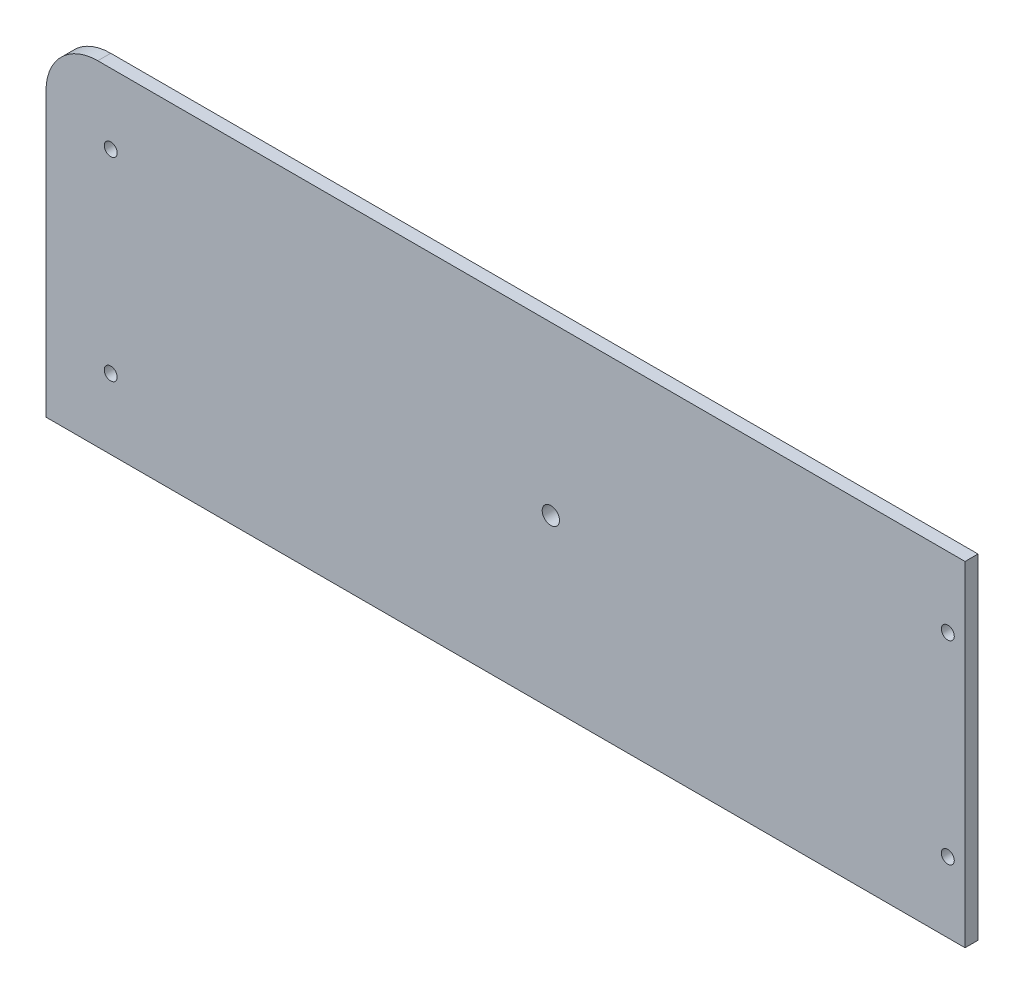
ISO-10303-21;
HEADER;
FILE_DESCRIPTION(('STEP AP214'),'2;1');
FILE_NAME('part.step','',(''),(''),'','','');
FILE_SCHEMA(('AUTOMOTIVE_DESIGN { 1 0 10303 214 1 1 1 1 }'));
ENDSEC;
DATA;
#1=APPLICATION_CONTEXT('core data for automotive mechanical design processes');
#2=APPLICATION_PROTOCOL_DEFINITION('international standard','automotive_design',2000,#1);
#3=PRODUCT_CONTEXT('',#1,'mechanical');
#4=PRODUCT('Part','Part','',(#3));
#5=PRODUCT_RELATED_PRODUCT_CATEGORY('part','',(#4));
#6=PRODUCT_DEFINITION_FORMATION('','',#4);
#7=PRODUCT_DEFINITION_CONTEXT('part definition',#1,'design');
#8=PRODUCT_DEFINITION('design','',#6,#7);
#9=PRODUCT_DEFINITION_SHAPE('','',#8);
#10=(LENGTH_UNIT() NAMED_UNIT(*) SI_UNIT(.MILLI.,.METRE.));
#11=(NAMED_UNIT(*) PLANE_ANGLE_UNIT() SI_UNIT($,.RADIAN.));
#12=(NAMED_UNIT(*) SI_UNIT($,.STERADIAN.) SOLID_ANGLE_UNIT());
#13=UNCERTAINTY_MEASURE_WITH_UNIT(LENGTH_MEASURE(1.E-05),#10,'distance_accuracy_value','');
#14=(GEOMETRIC_REPRESENTATION_CONTEXT(3) GLOBAL_UNCERTAINTY_ASSIGNED_CONTEXT((#13)) GLOBAL_UNIT_ASSIGNED_CONTEXT((#10,
#11,#12)) REPRESENTATION_CONTEXT('',''));
#15=CARTESIAN_POINT('',(0.,0.,0.));
#16=DIRECTION('',(0.,0.,1.));
#17=DIRECTION('',(1.,0.,0.));
#18=AXIS2_PLACEMENT_3D('',#15,#16,#17);
#19=CARTESIAN_POINT('',(106.5,-38.77,3.));
#20=DIRECTION('',(-1.,0.,0.));
#21=DIRECTION('',(0.,0.,1.));
#22=AXIS2_PLACEMENT_3D('',#19,#20,#21);
#23=PLANE('',#22);
#24=DIRECTION('',(0.,1.,0.));
#25=VECTOR('',#24,1.);
#26=CARTESIAN_POINT('',(106.5,-38.77,0.));
#27=LINE('',#26,#25);
#28=CARTESIAN_POINT('',(106.5,-38.77,0.));
#29=VERTEX_POINT('',#28);
#30=CARTESIAN_POINT('',(106.5,38.77,0.));
#31=VERTEX_POINT('',#30);
#32=EDGE_CURVE('E109',#29,#31,#27,.T.);
#33=ORIENTED_EDGE('',*,*,#32,.T.);
#34=DIRECTION('',(0.,0.,-1.));
#35=VECTOR('',#34,1.);
#36=CARTESIAN_POINT('',(106.5,38.77,3.));
#37=LINE('',#36,#35);
#38=CARTESIAN_POINT('',(106.5,38.77,3.));
#39=VERTEX_POINT('',#38);
#40=EDGE_CURVE('E90',#39,#31,#37,.T.);
#41=ORIENTED_EDGE('',*,*,#40,.F.);
#42=DIRECTION('',(0.,1.,0.));
#43=VECTOR('',#42,1.);
#44=CARTESIAN_POINT('',(106.5,-38.77,3.));
#45=LINE('',#44,#43);
#46=CARTESIAN_POINT('',(106.5,-38.77,3.));
#47=VERTEX_POINT('',#46);
#48=EDGE_CURVE('E96',#47,#39,#45,.T.);
#49=ORIENTED_EDGE('',*,*,#48,.F.);
#50=DIRECTION('',(0.,0.,-1.));
#51=VECTOR('',#50,1.);
#52=CARTESIAN_POINT('',(106.5,-38.77,3.));
#53=LINE('',#52,#51);
#54=EDGE_CURVE('E119',#47,#29,#53,.T.);
#55=ORIENTED_EDGE('',*,*,#54,.T.);
#56=EDGE_LOOP('',(#33,#41,#49,#55));
#57=FACE_BOUND('',#56,.T.);
#58=ADVANCED_FACE('F42',(#57),#23,.F.);
#59=CARTESIAN_POINT('',(-106.5,38.77,3.));
#60=DIRECTION('',(0.,-1.,0.));
#61=DIRECTION('',(0.,0.,-1.));
#62=AXIS2_PLACEMENT_3D('',#59,#60,#61);
#63=PLANE('',#62);
#64=DIRECTION('',(-1.,0.,0.));
#65=VECTOR('',#64,1.);
#66=CARTESIAN_POINT('',(-106.5,38.77,0.));
#67=LINE('',#66,#65);
#68=CARTESIAN_POINT('',(-94.5,38.77,0.));
#69=VERTEX_POINT('',#68);
#70=EDGE_CURVE('E132',#31,#69,#67,.T.);
#71=ORIENTED_EDGE('',*,*,#70,.T.);
#72=DIRECTION('',(0.,0.,-1.));
#73=VECTOR('',#72,1.);
#74=CARTESIAN_POINT('',(-94.5,38.77,3.));
#75=LINE('',#74,#73);
#76=CARTESIAN_POINT('',(-94.5,38.77,3.));
#77=VERTEX_POINT('',#76);
#78=EDGE_CURVE('E51',#69,#77,#75,.F.);
#79=ORIENTED_EDGE('',*,*,#78,.T.);
#80=DIRECTION('',(-1.,0.,0.));
#81=VECTOR('',#80,1.);
#82=CARTESIAN_POINT('',(-106.5,38.77,3.));
#83=LINE('',#82,#81);
#84=EDGE_CURVE('E86',#39,#77,#83,.T.);
#85=ORIENTED_EDGE('',*,*,#84,.F.);
#86=ORIENTED_EDGE('',*,*,#40,.T.);
#87=EDGE_LOOP('',(#71,#79,#85,#86));
#88=FACE_BOUND('',#87,.T.);
#89=ADVANCED_FACE('F88',(#88),#63,.F.);
#90=CARTESIAN_POINT('',(-106.5,-38.77,3.));
#91=DIRECTION('',(1.,0.,0.));
#92=DIRECTION('',(0.,0.,-1.));
#93=AXIS2_PLACEMENT_3D('',#90,#91,#92);
#94=PLANE('',#93);
#95=DIRECTION('',(0.,-1.,0.));
#96=VECTOR('',#95,1.);
#97=CARTESIAN_POINT('',(-106.5,-38.77,3.));
#98=LINE('',#97,#96);
#99=CARTESIAN_POINT('',(-106.5,26.77,3.));
#100=VERTEX_POINT('',#99);
#101=CARTESIAN_POINT('',(-106.5,-38.77,3.));
#102=VERTEX_POINT('',#101);
#103=EDGE_CURVE('E95',#100,#102,#98,.T.);
#104=ORIENTED_EDGE('',*,*,#103,.F.);
#105=DIRECTION('',(0.,0.,-1.));
#106=VECTOR('',#105,1.);
#107=CARTESIAN_POINT('',(-106.5,26.77,3.));
#108=LINE('',#107,#106);
#109=CARTESIAN_POINT('',(-106.5,26.77,0.));
#110=VERTEX_POINT('',#109);
#111=EDGE_CURVE('E111',#100,#110,#108,.T.);
#112=ORIENTED_EDGE('',*,*,#111,.T.);
#113=DIRECTION('',(0.,-1.,0.));
#114=VECTOR('',#113,1.);
#115=CARTESIAN_POINT('',(-106.5,-38.77,0.));
#116=LINE('',#115,#114);
#117=CARTESIAN_POINT('',(-106.5,-38.77,0.));
#118=VERTEX_POINT('',#117);
#119=EDGE_CURVE('E129',#110,#118,#116,.T.);
#120=ORIENTED_EDGE('',*,*,#119,.T.);
#121=DIRECTION('',(0.,0.,-1.));
#122=VECTOR('',#121,1.);
#123=CARTESIAN_POINT('',(-106.5,-38.77,3.));
#124=LINE('',#123,#122);
#125=EDGE_CURVE('E112',#102,#118,#124,.T.);
#126=ORIENTED_EDGE('',*,*,#125,.F.);
#127=EDGE_LOOP('',(#104,#112,#120,#126));
#128=FACE_BOUND('',#127,.T.);
#129=ADVANCED_FACE('F200',(#128),#94,.F.);
#130=CARTESIAN_POINT('',(-106.5,-38.77,3.));
#131=DIRECTION('',(0.,1.,0.));
#132=DIRECTION('',(0.,0.,1.));
#133=AXIS2_PLACEMENT_3D('',#130,#131,#132);
#134=PLANE('',#133);
#135=DIRECTION('',(1.,0.,0.));
#136=VECTOR('',#135,1.);
#137=CARTESIAN_POINT('',(-106.5,-38.77,0.));
#138=LINE('',#137,#136);
#139=EDGE_CURVE('E106',#118,#29,#138,.T.);
#140=ORIENTED_EDGE('',*,*,#139,.T.);
#141=ORIENTED_EDGE('',*,*,#54,.F.);
#142=DIRECTION('',(1.,0.,0.));
#143=VECTOR('',#142,1.);
#144=CARTESIAN_POINT('',(-106.5,-38.77,3.));
#145=LINE('',#144,#143);
#146=EDGE_CURVE('E101',#102,#47,#145,.T.);
#147=ORIENTED_EDGE('',*,*,#146,.F.);
#148=ORIENTED_EDGE('',*,*,#125,.T.);
#149=EDGE_LOOP('',(#140,#141,#147,#148));
#150=FACE_BOUND('',#149,.T.);
#151=ADVANCED_FACE('F203',(#150),#134,.F.);
#152=CARTESIAN_POINT('',(0.,0.,3.));
#153=DIRECTION('',(0.,0.,-1.));
#154=DIRECTION('',(-1.,0.,0.));
#155=AXIS2_PLACEMENT_3D('',#152,#153,#154);
#156=PLANE('',#155);
#157=CARTESIAN_POINT('',(-91.5,22.5,3.));
#158=DIRECTION('',(0.,0.,-1.));
#159=DIRECTION('',(-1.,0.,0.));
#160=AXIS2_PLACEMENT_3D('',#157,#158,#159);
#161=CIRCLE('',#160,1.5);
#162=CARTESIAN_POINT('',(-93.,22.5,3.));
#163=VERTEX_POINT('',#162);
#164=EDGE_CURVE('E159',#163,#163,#161,.F.);
#165=ORIENTED_EDGE('',*,*,#164,.F.);
#166=EDGE_LOOP('',(#165));
#167=FACE_BOUND('',#166,.T.);
#168=CARTESIAN_POINT('',(-91.5,-22.5,3.));
#169=DIRECTION('',(0.,0.,-1.));
#170=DIRECTION('',(-1.,0.,0.));
#171=AXIS2_PLACEMENT_3D('',#168,#169,#170);
#172=CIRCLE('',#171,1.5);
#173=CARTESIAN_POINT('',(-93.,-22.5,3.));
#174=VERTEX_POINT('',#173);
#175=EDGE_CURVE('E171',#174,#174,#172,.F.);
#176=ORIENTED_EDGE('',*,*,#175,.F.);
#177=EDGE_LOOP('',(#176));
#178=FACE_BOUND('',#177,.T.);
#179=CARTESIAN_POINT('',(102.5,22.5,3.));
#180=DIRECTION('',(0.,0.,-1.));
#181=DIRECTION('',(-1.,0.,0.));
#182=AXIS2_PLACEMENT_3D('',#179,#180,#181);
#183=CIRCLE('',#182,1.5);
#184=CARTESIAN_POINT('',(101.,22.5,3.));
#185=VERTEX_POINT('',#184);
#186=EDGE_CURVE('E149',#185,#185,#183,.F.);
#187=ORIENTED_EDGE('',*,*,#186,.F.);
#188=EDGE_LOOP('',(#187));
#189=FACE_BOUND('',#188,.T.);
#190=CARTESIAN_POINT('',(102.5,-22.5,3.));
#191=DIRECTION('',(0.,0.,-1.));
#192=DIRECTION('',(-1.,0.,0.));
#193=AXIS2_PLACEMENT_3D('',#190,#191,#192);
#194=CIRCLE('',#193,1.5);
#195=CARTESIAN_POINT('',(101.,-22.5,3.));
#196=VERTEX_POINT('',#195);
#197=EDGE_CURVE('E155',#196,#196,#194,.F.);
#198=ORIENTED_EDGE('',*,*,#197,.F.);
#199=EDGE_LOOP('',(#198));
#200=FACE_BOUND('',#199,.T.);
#201=CARTESIAN_POINT('',(10.5,0.,3.));
#202=DIRECTION('',(0.,0.,-1.));
#203=DIRECTION('',(-1.,0.,0.));
#204=AXIS2_PLACEMENT_3D('',#201,#202,#203);
#205=CIRCLE('',#204,2.);
#206=CARTESIAN_POINT('',(8.5,0.,3.));
#207=VERTEX_POINT('',#206);
#208=EDGE_CURVE('E137',#207,#207,#205,.F.);
#209=ORIENTED_EDGE('',*,*,#208,.F.);
#210=EDGE_LOOP('',(#209));
#211=FACE_BOUND('',#210,.T.);
#212=ORIENTED_EDGE('',*,*,#84,.T.);
#213=CARTESIAN_POINT('',(-94.5,26.77,3.));
#214=DIRECTION('',(0.,0.,-1.));
#215=DIRECTION('',(-1.,0.,0.));
#216=AXIS2_PLACEMENT_3D('',#213,#214,#215);
#217=CIRCLE('',#216,12.);
#218=EDGE_CURVE('E11',#77,#100,#217,.F.);
#219=ORIENTED_EDGE('',*,*,#218,.T.);
#220=ORIENTED_EDGE('',*,*,#103,.T.);
#221=ORIENTED_EDGE('',*,*,#146,.T.);
#222=ORIENTED_EDGE('',*,*,#48,.T.);
#223=EDGE_LOOP('',(#212,#219,#220,#221,#222));
#224=FACE_BOUND('',#223,.T.);
#225=ADVANCED_FACE('F99',(#167,#178,#189,#200,#211,#224),#156,.F.);
#226=CARTESIAN_POINT('',(0.,0.,0.));
#227=DIRECTION('',(0.,0.,-1.));
#228=DIRECTION('',(-1.,0.,0.));
#229=AXIS2_PLACEMENT_3D('',#226,#227,#228);
#230=PLANE('',#229);
#231=CARTESIAN_POINT('',(-91.5,22.5,0.));
#232=DIRECTION('',(0.,0.,-1.));
#233=DIRECTION('',(-1.,0.,0.));
#234=AXIS2_PLACEMENT_3D('',#231,#232,#233);
#235=CIRCLE('',#234,1.5);
#236=CARTESIAN_POINT('',(-93.,22.5,0.));
#237=VERTEX_POINT('',#236);
#238=EDGE_CURVE('E170',#237,#237,#235,.T.);
#239=ORIENTED_EDGE('',*,*,#238,.F.);
#240=EDGE_LOOP('',(#239));
#241=FACE_BOUND('',#240,.T.);
#242=CARTESIAN_POINT('',(-91.5,-22.5,0.));
#243=DIRECTION('',(0.,0.,-1.));
#244=DIRECTION('',(-1.,0.,0.));
#245=AXIS2_PLACEMENT_3D('',#242,#243,#244);
#246=CIRCLE('',#245,1.5);
#247=CARTESIAN_POINT('',(-93.,-22.5,0.));
#248=VERTEX_POINT('',#247);
#249=EDGE_CURVE('E166',#248,#248,#246,.T.);
#250=ORIENTED_EDGE('',*,*,#249,.F.);
#251=EDGE_LOOP('',(#250));
#252=FACE_BOUND('',#251,.T.);
#253=CARTESIAN_POINT('',(102.5,22.5,0.));
#254=DIRECTION('',(0.,0.,-1.));
#255=DIRECTION('',(-1.,0.,0.));
#256=AXIS2_PLACEMENT_3D('',#253,#254,#255);
#257=CIRCLE('',#256,1.5);
#258=CARTESIAN_POINT('',(101.,22.5,0.));
#259=VERTEX_POINT('',#258);
#260=EDGE_CURVE('E154',#259,#259,#257,.T.);
#261=ORIENTED_EDGE('',*,*,#260,.F.);
#262=EDGE_LOOP('',(#261));
#263=FACE_BOUND('',#262,.T.);
#264=CARTESIAN_POINT('',(102.5,-22.5,0.));
#265=DIRECTION('',(0.,0.,-1.));
#266=DIRECTION('',(-1.,0.,0.));
#267=AXIS2_PLACEMENT_3D('',#264,#265,#266);
#268=CIRCLE('',#267,1.5);
#269=CARTESIAN_POINT('',(101.,-22.5,0.));
#270=VERTEX_POINT('',#269);
#271=EDGE_CURVE('E150',#270,#270,#268,.T.);
#272=ORIENTED_EDGE('',*,*,#271,.F.);
#273=EDGE_LOOP('',(#272));
#274=FACE_BOUND('',#273,.T.);
#275=CARTESIAN_POINT('',(10.5,0.,0.));
#276=DIRECTION('',(0.,0.,-1.));
#277=DIRECTION('',(-1.,0.,0.));
#278=AXIS2_PLACEMENT_3D('',#275,#276,#277);
#279=CIRCLE('',#278,2.);
#280=CARTESIAN_POINT('',(8.5,0.,0.));
#281=VERTEX_POINT('',#280);
#282=EDGE_CURVE('E145',#281,#281,#279,.T.);
#283=ORIENTED_EDGE('',*,*,#282,.F.);
#284=EDGE_LOOP('',(#283));
#285=FACE_BOUND('',#284,.T.);
#286=ORIENTED_EDGE('',*,*,#119,.F.);
#287=CARTESIAN_POINT('',(-94.5,26.77,0.));
#288=DIRECTION('',(0.,0.,-1.));
#289=DIRECTION('',(-1.,0.,0.));
#290=AXIS2_PLACEMENT_3D('',#287,#288,#289);
#291=CIRCLE('',#290,12.);
#292=EDGE_CURVE('E65',#110,#69,#291,.T.);
#293=ORIENTED_EDGE('',*,*,#292,.T.);
#294=ORIENTED_EDGE('',*,*,#70,.F.);
#295=ORIENTED_EDGE('',*,*,#32,.F.);
#296=ORIENTED_EDGE('',*,*,#139,.F.);
#297=EDGE_LOOP('',(#286,#293,#294,#295,#296));
#298=FACE_BOUND('',#297,.T.);
#299=ADVANCED_FACE('F185',(#241,#252,#263,#274,#285,#298),#230,.T.);
#300=CARTESIAN_POINT('',(-94.5,26.77,3.));
#301=DIRECTION('',(0.,0.,-1.));
#302=DIRECTION('',(-1.,0.,0.));
#303=AXIS2_PLACEMENT_3D('',#300,#301,#302);
#304=CYLINDRICAL_SURFACE('',#303,12.);
#305=ORIENTED_EDGE('',*,*,#218,.F.);
#306=ORIENTED_EDGE('',*,*,#78,.F.);
#307=ORIENTED_EDGE('',*,*,#292,.F.);
#308=ORIENTED_EDGE('',*,*,#111,.F.);
#309=EDGE_LOOP('',(#305,#306,#307,#308));
#310=FACE_BOUND('',#309,.T.);
#311=ADVANCED_FACE('F44',(#310),#304,.T.);
#312=CARTESIAN_POINT('',(10.5,0.,3.001));
#313=DIRECTION('',(0.,0.,-1.));
#314=DIRECTION('',(-1.,0.,0.));
#315=AXIS2_PLACEMENT_3D('',#312,#313,#314);
#316=CYLINDRICAL_SURFACE('',#315,2.);
#317=CARTESIAN_POINT('',(8.5,0.,0.));
#318=CARTESIAN_POINT('',(8.5,0.,0.0312500000000005));
#319=CARTESIAN_POINT('',(8.5,0.,0.0625000000000005));
#320=CARTESIAN_POINT('',(8.5,0.,0.125000000000001));
#321=CARTESIAN_POINT('',(8.5,0.,0.156250000000001));
#322=CARTESIAN_POINT('',(8.5,0.,0.218750000000001));
#323=CARTESIAN_POINT('',(8.5,0.,0.250000000000001));
#324=CARTESIAN_POINT('',(8.5,0.,0.312500000000001));
#325=CARTESIAN_POINT('',(8.5,0.,0.34375));
#326=CARTESIAN_POINT('',(8.5,0.,0.40625));
#327=CARTESIAN_POINT('',(8.5,0.,0.4375));
#328=CARTESIAN_POINT('',(8.5,0.,0.5));
#329=CARTESIAN_POINT('',(8.5,0.,0.53125));
#330=CARTESIAN_POINT('',(8.5,0.,0.593750000000001));
#331=CARTESIAN_POINT('',(8.5,0.,0.625000000000001));
#332=CARTESIAN_POINT('',(8.5,0.,0.687500000000001));
#333=CARTESIAN_POINT('',(8.5,0.,0.71875));
#334=CARTESIAN_POINT('',(8.5,0.,0.78125));
#335=CARTESIAN_POINT('',(8.5,0.,0.8125));
#336=CARTESIAN_POINT('',(8.5,0.,0.875));
#337=CARTESIAN_POINT('',(8.5,0.,0.90625));
#338=CARTESIAN_POINT('',(8.5,0.,0.96875));
#339=CARTESIAN_POINT('',(8.5,0.,1.));
#340=CARTESIAN_POINT('',(8.5,0.,1.0625));
#341=CARTESIAN_POINT('',(8.5,0.,1.09375));
#342=CARTESIAN_POINT('',(8.5,0.,1.15625));
#343=CARTESIAN_POINT('',(8.5,0.,1.1875));
#344=CARTESIAN_POINT('',(8.5,0.,1.25));
#345=CARTESIAN_POINT('',(8.5,0.,1.28125));
#346=CARTESIAN_POINT('',(8.5,0.,1.34375));
#347=CARTESIAN_POINT('',(8.5,0.,1.375));
#348=CARTESIAN_POINT('',(8.5,0.,1.4375));
#349=CARTESIAN_POINT('',(8.5,0.,1.46875));
#350=CARTESIAN_POINT('',(8.5,0.,1.53125));
#351=CARTESIAN_POINT('',(8.5,0.,1.5625));
#352=CARTESIAN_POINT('',(8.5,0.,1.625));
#353=CARTESIAN_POINT('',(8.5,0.,1.65625));
#354=CARTESIAN_POINT('',(8.5,0.,1.71875));
#355=CARTESIAN_POINT('',(8.5,0.,1.75));
#356=CARTESIAN_POINT('',(8.5,0.,1.8125));
#357=CARTESIAN_POINT('',(8.5,0.,1.84375));
#358=CARTESIAN_POINT('',(8.5,0.,1.90625));
#359=CARTESIAN_POINT('',(8.5,0.,1.9375));
#360=CARTESIAN_POINT('',(8.5,0.,2.));
#361=CARTESIAN_POINT('',(8.5,0.,2.03125));
#362=CARTESIAN_POINT('',(8.5,0.,2.09375));
#363=CARTESIAN_POINT('',(8.5,0.,2.125));
#364=CARTESIAN_POINT('',(8.5,0.,2.1875));
#365=CARTESIAN_POINT('',(8.5,0.,2.21875));
#366=CARTESIAN_POINT('',(8.5,0.,2.28125));
#367=CARTESIAN_POINT('',(8.5,0.,2.3125));
#368=CARTESIAN_POINT('',(8.5,0.,2.375));
#369=CARTESIAN_POINT('',(8.5,0.,2.40625));
#370=CARTESIAN_POINT('',(8.5,0.,2.46875));
#371=CARTESIAN_POINT('',(8.5,0.,2.5));
#372=CARTESIAN_POINT('',(8.5,0.,2.5625));
#373=CARTESIAN_POINT('',(8.5,0.,2.59375));
#374=CARTESIAN_POINT('',(8.5,0.,2.65625));
#375=CARTESIAN_POINT('',(8.5,0.,2.6875));
#376=CARTESIAN_POINT('',(8.5,0.,2.75));
#377=CARTESIAN_POINT('',(8.5,0.,2.78125));
#378=CARTESIAN_POINT('',(8.5,0.,2.84375));
#379=CARTESIAN_POINT('',(8.5,0.,2.875));
#380=CARTESIAN_POINT('',(8.5,0.,2.9375));
#381=CARTESIAN_POINT('',(8.5,0.,2.96875));
#382=CARTESIAN_POINT('',(8.5,0.,3.));
#383=B_SPLINE_CURVE_WITH_KNOTS('',3,(#317,#318,#319,#320,#321,#322,#323,#324,#325,#326,#327,
#328,#329,#330,#331,#332,#333,#334,#335,#336,#337,#338,#339,#340,#341,#342,#343,#344,#345,#346,
#347,#348,#349,#350,#351,#352,#353,#354,#355,#356,#357,#358,#359,#360,#361,#362,#363,#364,#365,
#366,#367,#368,#369,#370,#371,#372,#373,#374,#375,#376,#377,#378,#379,#380,#381,#382),
.UNSPECIFIED.,.F.,.F.,(4,2,2,2,2,2,2,2,2,2,2,2,2,2,2,2,2,2,2,2,2,2,2,2,2,2,2,2,2,2,2,2,4),(0.,
0.0937500000000001,0.1875,0.28125,0.375,0.46875,0.5625,0.65625,0.75,0.84375,0.9375,1.03125,
1.125,1.21875,1.3125,1.40625,1.5,1.59375,1.6875,1.78125,1.875,1.96875,2.0625,2.15625,2.25,
2.34375,2.4375,2.53125,2.625,2.71875,2.8125,2.90625,3.),.UNSPECIFIED.);
#384=EDGE_CURVE('BSEAM206',#281,#207,#383,.T.);
#385=ORIENTED_EDGE('',*,*,#282,.T.);
#386=ORIENTED_EDGE('',*,*,#208,.T.);
#387=ORIENTED_EDGE('',*,*,#384,.T.);
#388=ORIENTED_EDGE('',*,*,#384,.F.);
#389=EDGE_LOOP('',(#385,#387,#386,#388));
#390=FACE_BOUND('',#389,.T.);
#391=ADVANCED_FACE('F206',(#390),#316,.F.);
#392=CARTESIAN_POINT('',(102.5,-22.5,3.001));
#393=DIRECTION('',(0.,0.,-1.));
#394=DIRECTION('',(-1.,0.,0.));
#395=AXIS2_PLACEMENT_3D('',#392,#393,#394);
#396=CYLINDRICAL_SURFACE('',#395,1.5);
#397=CARTESIAN_POINT('',(101.,-22.5,0.));
#398=CARTESIAN_POINT('',(101.,-22.5,0.0312500000000005));
#399=CARTESIAN_POINT('',(101.,-22.5,0.0625000000000005));
#400=CARTESIAN_POINT('',(101.,-22.5,0.125000000000001));
#401=CARTESIAN_POINT('',(101.,-22.5,0.156250000000001));
#402=CARTESIAN_POINT('',(101.,-22.5,0.218750000000001));
#403=CARTESIAN_POINT('',(101.,-22.5,0.250000000000001));
#404=CARTESIAN_POINT('',(101.,-22.5,0.312500000000001));
#405=CARTESIAN_POINT('',(101.,-22.5,0.34375));
#406=CARTESIAN_POINT('',(101.,-22.5,0.40625));
#407=CARTESIAN_POINT('',(101.,-22.5,0.4375));
#408=CARTESIAN_POINT('',(101.,-22.5,0.5));
#409=CARTESIAN_POINT('',(101.,-22.5,0.53125));
#410=CARTESIAN_POINT('',(101.,-22.5,0.593750000000001));
#411=CARTESIAN_POINT('',(101.,-22.5,0.625000000000001));
#412=CARTESIAN_POINT('',(101.,-22.5,0.687500000000001));
#413=CARTESIAN_POINT('',(101.,-22.5,0.71875));
#414=CARTESIAN_POINT('',(101.,-22.5,0.78125));
#415=CARTESIAN_POINT('',(101.,-22.5,0.8125));
#416=CARTESIAN_POINT('',(101.,-22.5,0.875));
#417=CARTESIAN_POINT('',(101.,-22.5,0.90625));
#418=CARTESIAN_POINT('',(101.,-22.5,0.96875));
#419=CARTESIAN_POINT('',(101.,-22.5,1.));
#420=CARTESIAN_POINT('',(101.,-22.5,1.0625));
#421=CARTESIAN_POINT('',(101.,-22.5,1.09375));
#422=CARTESIAN_POINT('',(101.,-22.5,1.15625));
#423=CARTESIAN_POINT('',(101.,-22.5,1.1875));
#424=CARTESIAN_POINT('',(101.,-22.5,1.25));
#425=CARTESIAN_POINT('',(101.,-22.5,1.28125));
#426=CARTESIAN_POINT('',(101.,-22.5,1.34375));
#427=CARTESIAN_POINT('',(101.,-22.5,1.375));
#428=CARTESIAN_POINT('',(101.,-22.5,1.4375));
#429=CARTESIAN_POINT('',(101.,-22.5,1.46875));
#430=CARTESIAN_POINT('',(101.,-22.5,1.53125));
#431=CARTESIAN_POINT('',(101.,-22.5,1.5625));
#432=CARTESIAN_POINT('',(101.,-22.5,1.625));
#433=CARTESIAN_POINT('',(101.,-22.5,1.65625));
#434=CARTESIAN_POINT('',(101.,-22.5,1.71875));
#435=CARTESIAN_POINT('',(101.,-22.5,1.75));
#436=CARTESIAN_POINT('',(101.,-22.5,1.8125));
#437=CARTESIAN_POINT('',(101.,-22.5,1.84375));
#438=CARTESIAN_POINT('',(101.,-22.5,1.90625));
#439=CARTESIAN_POINT('',(101.,-22.5,1.9375));
#440=CARTESIAN_POINT('',(101.,-22.5,2.));
#441=CARTESIAN_POINT('',(101.,-22.5,2.03125));
#442=CARTESIAN_POINT('',(101.,-22.5,2.09375));
#443=CARTESIAN_POINT('',(101.,-22.5,2.125));
#444=CARTESIAN_POINT('',(101.,-22.5,2.1875));
#445=CARTESIAN_POINT('',(101.,-22.5,2.21875));
#446=CARTESIAN_POINT('',(101.,-22.5,2.28125));
#447=CARTESIAN_POINT('',(101.,-22.5,2.3125));
#448=CARTESIAN_POINT('',(101.,-22.5,2.375));
#449=CARTESIAN_POINT('',(101.,-22.5,2.40625));
#450=CARTESIAN_POINT('',(101.,-22.5,2.46875));
#451=CARTESIAN_POINT('',(101.,-22.5,2.5));
#452=CARTESIAN_POINT('',(101.,-22.5,2.5625));
#453=CARTESIAN_POINT('',(101.,-22.5,2.59375));
#454=CARTESIAN_POINT('',(101.,-22.5,2.65625));
#455=CARTESIAN_POINT('',(101.,-22.5,2.6875));
#456=CARTESIAN_POINT('',(101.,-22.5,2.75));
#457=CARTESIAN_POINT('',(101.,-22.5,2.78125));
#458=CARTESIAN_POINT('',(101.,-22.5,2.84375));
#459=CARTESIAN_POINT('',(101.,-22.5,2.875));
#460=CARTESIAN_POINT('',(101.,-22.5,2.9375));
#461=CARTESIAN_POINT('',(101.,-22.5,2.96875));
#462=CARTESIAN_POINT('',(101.,-22.5,3.));
#463=B_SPLINE_CURVE_WITH_KNOTS('',3,(#397,#398,#399,#400,#401,#402,#403,#404,#405,#406,#407,
#408,#409,#410,#411,#412,#413,#414,#415,#416,#417,#418,#419,#420,#421,#422,#423,#424,#425,#426,
#427,#428,#429,#430,#431,#432,#433,#434,#435,#436,#437,#438,#439,#440,#441,#442,#443,#444,#445,
#446,#447,#448,#449,#450,#451,#452,#453,#454,#455,#456,#457,#458,#459,#460,#461,#462),
.UNSPECIFIED.,.F.,.F.,(4,2,2,2,2,2,2,2,2,2,2,2,2,2,2,2,2,2,2,2,2,2,2,2,2,2,2,2,2,2,2,2,4),(0.,
0.0937500000000001,0.1875,0.28125,0.375,0.46875,0.5625,0.65625,0.75,0.84375,0.9375,1.03125,
1.125,1.21875,1.3125,1.40625,1.5,1.59375,1.6875,1.78125,1.875,1.96875,2.0625,2.15625,2.25,
2.34375,2.4375,2.53125,2.625,2.71875,2.8125,2.90625,3.),.UNSPECIFIED.);
#464=EDGE_CURVE('BSEAM210',#270,#196,#463,.T.);
#465=ORIENTED_EDGE('',*,*,#271,.T.);
#466=ORIENTED_EDGE('',*,*,#197,.T.);
#467=ORIENTED_EDGE('',*,*,#464,.T.);
#468=ORIENTED_EDGE('',*,*,#464,.F.);
#469=EDGE_LOOP('',(#465,#467,#466,#468));
#470=FACE_BOUND('',#469,.T.);
#471=ADVANCED_FACE('F210',(#470),#396,.F.);
#472=CARTESIAN_POINT('',(102.5,22.5,3.001));
#473=DIRECTION('',(0.,0.,-1.));
#474=DIRECTION('',(-1.,0.,0.));
#475=AXIS2_PLACEMENT_3D('',#472,#473,#474);
#476=CYLINDRICAL_SURFACE('',#475,1.5);
#477=CARTESIAN_POINT('',(101.,22.5,0.));
#478=CARTESIAN_POINT('',(101.,22.5,0.0312500000000005));
#479=CARTESIAN_POINT('',(101.,22.5,0.0625000000000005));
#480=CARTESIAN_POINT('',(101.,22.5,0.125000000000001));
#481=CARTESIAN_POINT('',(101.,22.5,0.156250000000001));
#482=CARTESIAN_POINT('',(101.,22.5,0.218750000000001));
#483=CARTESIAN_POINT('',(101.,22.5,0.250000000000001));
#484=CARTESIAN_POINT('',(101.,22.5,0.312500000000001));
#485=CARTESIAN_POINT('',(101.,22.5,0.34375));
#486=CARTESIAN_POINT('',(101.,22.5,0.40625));
#487=CARTESIAN_POINT('',(101.,22.5,0.4375));
#488=CARTESIAN_POINT('',(101.,22.5,0.5));
#489=CARTESIAN_POINT('',(101.,22.5,0.53125));
#490=CARTESIAN_POINT('',(101.,22.5,0.593750000000001));
#491=CARTESIAN_POINT('',(101.,22.5,0.625000000000001));
#492=CARTESIAN_POINT('',(101.,22.5,0.687500000000001));
#493=CARTESIAN_POINT('',(101.,22.5,0.71875));
#494=CARTESIAN_POINT('',(101.,22.5,0.78125));
#495=CARTESIAN_POINT('',(101.,22.5,0.8125));
#496=CARTESIAN_POINT('',(101.,22.5,0.875));
#497=CARTESIAN_POINT('',(101.,22.5,0.90625));
#498=CARTESIAN_POINT('',(101.,22.5,0.96875));
#499=CARTESIAN_POINT('',(101.,22.5,1.));
#500=CARTESIAN_POINT('',(101.,22.5,1.0625));
#501=CARTESIAN_POINT('',(101.,22.5,1.09375));
#502=CARTESIAN_POINT('',(101.,22.5,1.15625));
#503=CARTESIAN_POINT('',(101.,22.5,1.1875));
#504=CARTESIAN_POINT('',(101.,22.5,1.25));
#505=CARTESIAN_POINT('',(101.,22.5,1.28125));
#506=CARTESIAN_POINT('',(101.,22.5,1.34375));
#507=CARTESIAN_POINT('',(101.,22.5,1.375));
#508=CARTESIAN_POINT('',(101.,22.5,1.4375));
#509=CARTESIAN_POINT('',(101.,22.5,1.46875));
#510=CARTESIAN_POINT('',(101.,22.5,1.53125));
#511=CARTESIAN_POINT('',(101.,22.5,1.5625));
#512=CARTESIAN_POINT('',(101.,22.5,1.625));
#513=CARTESIAN_POINT('',(101.,22.5,1.65625));
#514=CARTESIAN_POINT('',(101.,22.5,1.71875));
#515=CARTESIAN_POINT('',(101.,22.5,1.75));
#516=CARTESIAN_POINT('',(101.,22.5,1.8125));
#517=CARTESIAN_POINT('',(101.,22.5,1.84375));
#518=CARTESIAN_POINT('',(101.,22.5,1.90625));
#519=CARTESIAN_POINT('',(101.,22.5,1.9375));
#520=CARTESIAN_POINT('',(101.,22.5,2.));
#521=CARTESIAN_POINT('',(101.,22.5,2.03125));
#522=CARTESIAN_POINT('',(101.,22.5,2.09375));
#523=CARTESIAN_POINT('',(101.,22.5,2.125));
#524=CARTESIAN_POINT('',(101.,22.5,2.1875));
#525=CARTESIAN_POINT('',(101.,22.5,2.21875));
#526=CARTESIAN_POINT('',(101.,22.5,2.28125));
#527=CARTESIAN_POINT('',(101.,22.5,2.3125));
#528=CARTESIAN_POINT('',(101.,22.5,2.375));
#529=CARTESIAN_POINT('',(101.,22.5,2.40625));
#530=CARTESIAN_POINT('',(101.,22.5,2.46875));
#531=CARTESIAN_POINT('',(101.,22.5,2.5));
#532=CARTESIAN_POINT('',(101.,22.5,2.5625));
#533=CARTESIAN_POINT('',(101.,22.5,2.59375));
#534=CARTESIAN_POINT('',(101.,22.5,2.65625));
#535=CARTESIAN_POINT('',(101.,22.5,2.6875));
#536=CARTESIAN_POINT('',(101.,22.5,2.75));
#537=CARTESIAN_POINT('',(101.,22.5,2.78125));
#538=CARTESIAN_POINT('',(101.,22.5,2.84375));
#539=CARTESIAN_POINT('',(101.,22.5,2.875));
#540=CARTESIAN_POINT('',(101.,22.5,2.9375));
#541=CARTESIAN_POINT('',(101.,22.5,2.96875));
#542=CARTESIAN_POINT('',(101.,22.5,3.));
#543=B_SPLINE_CURVE_WITH_KNOTS('',3,(#477,#478,#479,#480,#481,#482,#483,#484,#485,#486,#487,
#488,#489,#490,#491,#492,#493,#494,#495,#496,#497,#498,#499,#500,#501,#502,#503,#504,#505,#506,
#507,#508,#509,#510,#511,#512,#513,#514,#515,#516,#517,#518,#519,#520,#521,#522,#523,#524,#525,
#526,#527,#528,#529,#530,#531,#532,#533,#534,#535,#536,#537,#538,#539,#540,#541,#542),
.UNSPECIFIED.,.F.,.F.,(4,2,2,2,2,2,2,2,2,2,2,2,2,2,2,2,2,2,2,2,2,2,2,2,2,2,2,2,2,2,2,2,4),(0.,
0.0937500000000001,0.1875,0.28125,0.375,0.46875,0.5625,0.65625,0.75,0.84375,0.9375,1.03125,
1.125,1.21875,1.3125,1.40625,1.5,1.59375,1.6875,1.78125,1.875,1.96875,2.0625,2.15625,2.25,
2.34375,2.4375,2.53125,2.625,2.71875,2.8125,2.90625,3.),.UNSPECIFIED.);
#544=EDGE_CURVE('BSEAM228',#259,#185,#543,.T.);
#545=ORIENTED_EDGE('',*,*,#260,.T.);
#546=ORIENTED_EDGE('',*,*,#186,.T.);
#547=ORIENTED_EDGE('',*,*,#544,.T.);
#548=ORIENTED_EDGE('',*,*,#544,.F.);
#549=EDGE_LOOP('',(#545,#547,#546,#548));
#550=FACE_BOUND('',#549,.T.);
#551=ADVANCED_FACE('F228',(#550),#476,.F.);
#552=CARTESIAN_POINT('',(-91.5,-22.5,3.001));
#553=DIRECTION('',(0.,0.,-1.));
#554=DIRECTION('',(-1.,0.,0.));
#555=AXIS2_PLACEMENT_3D('',#552,#553,#554);
#556=CYLINDRICAL_SURFACE('',#555,1.5);
#557=CARTESIAN_POINT('',(-93.,-22.5,0.));
#558=CARTESIAN_POINT('',(-93.,-22.5,0.0312500000000005));
#559=CARTESIAN_POINT('',(-93.,-22.5,0.0625000000000005));
#560=CARTESIAN_POINT('',(-93.,-22.5,0.125000000000001));
#561=CARTESIAN_POINT('',(-93.,-22.5,0.156250000000001));
#562=CARTESIAN_POINT('',(-93.,-22.5,0.218750000000001));
#563=CARTESIAN_POINT('',(-93.,-22.5,0.250000000000001));
#564=CARTESIAN_POINT('',(-93.,-22.5,0.312500000000001));
#565=CARTESIAN_POINT('',(-93.,-22.5,0.34375));
#566=CARTESIAN_POINT('',(-93.,-22.5,0.40625));
#567=CARTESIAN_POINT('',(-93.,-22.5,0.4375));
#568=CARTESIAN_POINT('',(-93.,-22.5,0.5));
#569=CARTESIAN_POINT('',(-93.,-22.5,0.53125));
#570=CARTESIAN_POINT('',(-93.,-22.5,0.593750000000001));
#571=CARTESIAN_POINT('',(-93.,-22.5,0.625000000000001));
#572=CARTESIAN_POINT('',(-93.,-22.5,0.687500000000001));
#573=CARTESIAN_POINT('',(-93.,-22.5,0.71875));
#574=CARTESIAN_POINT('',(-93.,-22.5,0.78125));
#575=CARTESIAN_POINT('',(-93.,-22.5,0.8125));
#576=CARTESIAN_POINT('',(-93.,-22.5,0.875));
#577=CARTESIAN_POINT('',(-93.,-22.5,0.90625));
#578=CARTESIAN_POINT('',(-93.,-22.5,0.96875));
#579=CARTESIAN_POINT('',(-93.,-22.5,1.));
#580=CARTESIAN_POINT('',(-93.,-22.5,1.0625));
#581=CARTESIAN_POINT('',(-93.,-22.5,1.09375));
#582=CARTESIAN_POINT('',(-93.,-22.5,1.15625));
#583=CARTESIAN_POINT('',(-93.,-22.5,1.1875));
#584=CARTESIAN_POINT('',(-93.,-22.5,1.25));
#585=CARTESIAN_POINT('',(-93.,-22.5,1.28125));
#586=CARTESIAN_POINT('',(-93.,-22.5,1.34375));
#587=CARTESIAN_POINT('',(-93.,-22.5,1.375));
#588=CARTESIAN_POINT('',(-93.,-22.5,1.4375));
#589=CARTESIAN_POINT('',(-93.,-22.5,1.46875));
#590=CARTESIAN_POINT('',(-93.,-22.5,1.53125));
#591=CARTESIAN_POINT('',(-93.,-22.5,1.5625));
#592=CARTESIAN_POINT('',(-93.,-22.5,1.625));
#593=CARTESIAN_POINT('',(-93.,-22.5,1.65625));
#594=CARTESIAN_POINT('',(-93.,-22.5,1.71875));
#595=CARTESIAN_POINT('',(-93.,-22.5,1.75));
#596=CARTESIAN_POINT('',(-93.,-22.5,1.8125));
#597=CARTESIAN_POINT('',(-93.,-22.5,1.84375));
#598=CARTESIAN_POINT('',(-93.,-22.5,1.90625));
#599=CARTESIAN_POINT('',(-93.,-22.5,1.9375));
#600=CARTESIAN_POINT('',(-93.,-22.5,2.));
#601=CARTESIAN_POINT('',(-93.,-22.5,2.03125));
#602=CARTESIAN_POINT('',(-93.,-22.5,2.09375));
#603=CARTESIAN_POINT('',(-93.,-22.5,2.125));
#604=CARTESIAN_POINT('',(-93.,-22.5,2.1875));
#605=CARTESIAN_POINT('',(-93.,-22.5,2.21875));
#606=CARTESIAN_POINT('',(-93.,-22.5,2.28125));
#607=CARTESIAN_POINT('',(-93.,-22.5,2.3125));
#608=CARTESIAN_POINT('',(-93.,-22.5,2.375));
#609=CARTESIAN_POINT('',(-93.,-22.5,2.40625));
#610=CARTESIAN_POINT('',(-93.,-22.5,2.46875));
#611=CARTESIAN_POINT('',(-93.,-22.5,2.5));
#612=CARTESIAN_POINT('',(-93.,-22.5,2.5625));
#613=CARTESIAN_POINT('',(-93.,-22.5,2.59375));
#614=CARTESIAN_POINT('',(-93.,-22.5,2.65625));
#615=CARTESIAN_POINT('',(-93.,-22.5,2.6875));
#616=CARTESIAN_POINT('',(-93.,-22.5,2.75));
#617=CARTESIAN_POINT('',(-93.,-22.5,2.78125));
#618=CARTESIAN_POINT('',(-93.,-22.5,2.84375));
#619=CARTESIAN_POINT('',(-93.,-22.5,2.875));
#620=CARTESIAN_POINT('',(-93.,-22.5,2.9375));
#621=CARTESIAN_POINT('',(-93.,-22.5,2.96875));
#622=CARTESIAN_POINT('',(-93.,-22.5,3.));
#623=B_SPLINE_CURVE_WITH_KNOTS('',3,(#557,#558,#559,#560,#561,#562,#563,#564,#565,#566,#567,
#568,#569,#570,#571,#572,#573,#574,#575,#576,#577,#578,#579,#580,#581,#582,#583,#584,#585,#586,
#587,#588,#589,#590,#591,#592,#593,#594,#595,#596,#597,#598,#599,#600,#601,#602,#603,#604,#605,
#606,#607,#608,#609,#610,#611,#612,#613,#614,#615,#616,#617,#618,#619,#620,#621,#622),
.UNSPECIFIED.,.F.,.F.,(4,2,2,2,2,2,2,2,2,2,2,2,2,2,2,2,2,2,2,2,2,2,2,2,2,2,2,2,2,2,2,2,4),(0.,
0.0937500000000001,0.1875,0.28125,0.375,0.46875,0.5625,0.65625,0.75,0.84375,0.9375,1.03125,
1.125,1.21875,1.3125,1.40625,1.5,1.59375,1.6875,1.78125,1.875,1.96875,2.0625,2.15625,2.25,
2.34375,2.4375,2.53125,2.625,2.71875,2.8125,2.90625,3.),.UNSPECIFIED.);
#624=EDGE_CURVE('BSEAM232',#248,#174,#623,.T.);
#625=ORIENTED_EDGE('',*,*,#249,.T.);
#626=ORIENTED_EDGE('',*,*,#175,.T.);
#627=ORIENTED_EDGE('',*,*,#624,.T.);
#628=ORIENTED_EDGE('',*,*,#624,.F.);
#629=EDGE_LOOP('',(#625,#627,#626,#628));
#630=FACE_BOUND('',#629,.T.);
#631=ADVANCED_FACE('F232',(#630),#556,.F.);
#632=CARTESIAN_POINT('',(-91.5,22.5,3.001));
#633=DIRECTION('',(0.,0.,-1.));
#634=DIRECTION('',(-1.,0.,0.));
#635=AXIS2_PLACEMENT_3D('',#632,#633,#634);
#636=CYLINDRICAL_SURFACE('',#635,1.5);
#637=CARTESIAN_POINT('',(-93.,22.5,0.));
#638=CARTESIAN_POINT('',(-93.,22.5,0.0312500000000005));
#639=CARTESIAN_POINT('',(-93.,22.5,0.0625000000000005));
#640=CARTESIAN_POINT('',(-93.,22.5,0.125000000000001));
#641=CARTESIAN_POINT('',(-93.,22.5,0.156250000000001));
#642=CARTESIAN_POINT('',(-93.,22.5,0.218750000000001));
#643=CARTESIAN_POINT('',(-93.,22.5,0.250000000000001));
#644=CARTESIAN_POINT('',(-93.,22.5,0.312500000000001));
#645=CARTESIAN_POINT('',(-93.,22.5,0.34375));
#646=CARTESIAN_POINT('',(-93.,22.5,0.40625));
#647=CARTESIAN_POINT('',(-93.,22.5,0.4375));
#648=CARTESIAN_POINT('',(-93.,22.5,0.5));
#649=CARTESIAN_POINT('',(-93.,22.5,0.53125));
#650=CARTESIAN_POINT('',(-93.,22.5,0.593750000000001));
#651=CARTESIAN_POINT('',(-93.,22.5,0.625000000000001));
#652=CARTESIAN_POINT('',(-93.,22.5,0.687500000000001));
#653=CARTESIAN_POINT('',(-93.,22.5,0.71875));
#654=CARTESIAN_POINT('',(-93.,22.5,0.78125));
#655=CARTESIAN_POINT('',(-93.,22.5,0.8125));
#656=CARTESIAN_POINT('',(-93.,22.5,0.875));
#657=CARTESIAN_POINT('',(-93.,22.5,0.90625));
#658=CARTESIAN_POINT('',(-93.,22.5,0.96875));
#659=CARTESIAN_POINT('',(-93.,22.5,1.));
#660=CARTESIAN_POINT('',(-93.,22.5,1.0625));
#661=CARTESIAN_POINT('',(-93.,22.5,1.09375));
#662=CARTESIAN_POINT('',(-93.,22.5,1.15625));
#663=CARTESIAN_POINT('',(-93.,22.5,1.1875));
#664=CARTESIAN_POINT('',(-93.,22.5,1.25));
#665=CARTESIAN_POINT('',(-93.,22.5,1.28125));
#666=CARTESIAN_POINT('',(-93.,22.5,1.34375));
#667=CARTESIAN_POINT('',(-93.,22.5,1.375));
#668=CARTESIAN_POINT('',(-93.,22.5,1.4375));
#669=CARTESIAN_POINT('',(-93.,22.5,1.46875));
#670=CARTESIAN_POINT('',(-93.,22.5,1.53125));
#671=CARTESIAN_POINT('',(-93.,22.5,1.5625));
#672=CARTESIAN_POINT('',(-93.,22.5,1.625));
#673=CARTESIAN_POINT('',(-93.,22.5,1.65625));
#674=CARTESIAN_POINT('',(-93.,22.5,1.71875));
#675=CARTESIAN_POINT('',(-93.,22.5,1.75));
#676=CARTESIAN_POINT('',(-93.,22.5,1.8125));
#677=CARTESIAN_POINT('',(-93.,22.5,1.84375));
#678=CARTESIAN_POINT('',(-93.,22.5,1.90625));
#679=CARTESIAN_POINT('',(-93.,22.5,1.9375));
#680=CARTESIAN_POINT('',(-93.,22.5,2.));
#681=CARTESIAN_POINT('',(-93.,22.5,2.03125));
#682=CARTESIAN_POINT('',(-93.,22.5,2.09375));
#683=CARTESIAN_POINT('',(-93.,22.5,2.125));
#684=CARTESIAN_POINT('',(-93.,22.5,2.1875));
#685=CARTESIAN_POINT('',(-93.,22.5,2.21875));
#686=CARTESIAN_POINT('',(-93.,22.5,2.28125));
#687=CARTESIAN_POINT('',(-93.,22.5,2.3125));
#688=CARTESIAN_POINT('',(-93.,22.5,2.375));
#689=CARTESIAN_POINT('',(-93.,22.5,2.40625));
#690=CARTESIAN_POINT('',(-93.,22.5,2.46875));
#691=CARTESIAN_POINT('',(-93.,22.5,2.5));
#692=CARTESIAN_POINT('',(-93.,22.5,2.5625));
#693=CARTESIAN_POINT('',(-93.,22.5,2.59375));
#694=CARTESIAN_POINT('',(-93.,22.5,2.65625));
#695=CARTESIAN_POINT('',(-93.,22.5,2.6875));
#696=CARTESIAN_POINT('',(-93.,22.5,2.75));
#697=CARTESIAN_POINT('',(-93.,22.5,2.78125));
#698=CARTESIAN_POINT('',(-93.,22.5,2.84375));
#699=CARTESIAN_POINT('',(-93.,22.5,2.875));
#700=CARTESIAN_POINT('',(-93.,22.5,2.9375));
#701=CARTESIAN_POINT('',(-93.,22.5,2.96875));
#702=CARTESIAN_POINT('',(-93.,22.5,3.));
#703=B_SPLINE_CURVE_WITH_KNOTS('',3,(#637,#638,#639,#640,#641,#642,#643,#644,#645,#646,#647,
#648,#649,#650,#651,#652,#653,#654,#655,#656,#657,#658,#659,#660,#661,#662,#663,#664,#665,#666,
#667,#668,#669,#670,#671,#672,#673,#674,#675,#676,#677,#678,#679,#680,#681,#682,#683,#684,#685,
#686,#687,#688,#689,#690,#691,#692,#693,#694,#695,#696,#697,#698,#699,#700,#701,#702),
.UNSPECIFIED.,.F.,.F.,(4,2,2,2,2,2,2,2,2,2,2,2,2,2,2,2,2,2,2,2,2,2,2,2,2,2,2,2,2,2,2,2,4),(0.,
0.0937500000000001,0.1875,0.28125,0.375,0.46875,0.5625,0.65625,0.75,0.84375,0.9375,1.03125,
1.125,1.21875,1.3125,1.40625,1.5,1.59375,1.6875,1.78125,1.875,1.96875,2.0625,2.15625,2.25,
2.34375,2.4375,2.53125,2.625,2.71875,2.8125,2.90625,3.),.UNSPECIFIED.);
#704=EDGE_CURVE('BSEAM182',#237,#163,#703,.T.);
#705=ORIENTED_EDGE('',*,*,#238,.T.);
#706=ORIENTED_EDGE('',*,*,#164,.T.);
#707=ORIENTED_EDGE('',*,*,#704,.T.);
#708=ORIENTED_EDGE('',*,*,#704,.F.);
#709=EDGE_LOOP('',(#705,#707,#706,#708));
#710=FACE_BOUND('',#709,.T.);
#711=ADVANCED_FACE('F182',(#710),#636,.F.);
#712=CLOSED_SHELL('',(#58,#89,#129,#151,#225,#299,#311,#391,#471,#551,#631,#711));
#713=MANIFOLD_SOLID_BREP('B2',#712);
#714=ADVANCED_BREP_SHAPE_REPRESENTATION('',(#18,#713),#14);
#715=SHAPE_DEFINITION_REPRESENTATION(#9,#714);
ENDSEC;
END-ISO-10303-21;
